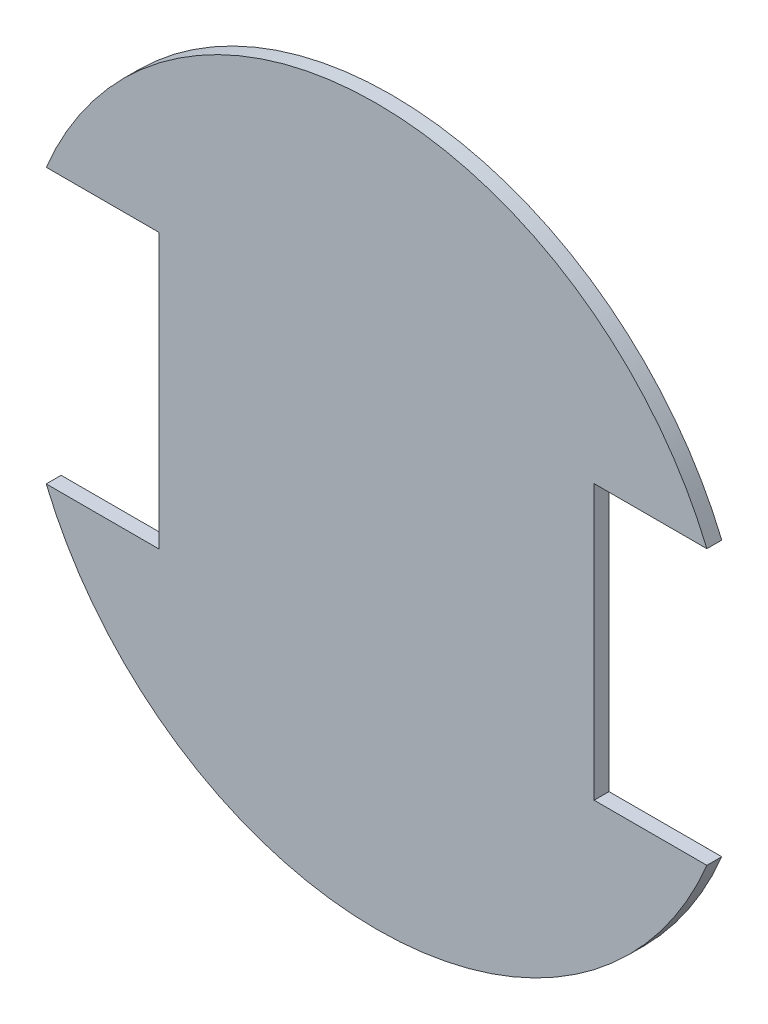
ISO-10303-21;
HEADER;
FILE_DESCRIPTION(('STEP AP214'),'2;1');
FILE_NAME('part.step','',(''),(''),'','','');
FILE_SCHEMA(('AUTOMOTIVE_DESIGN { 1 0 10303 214 1 1 1 1 }'));
ENDSEC;
DATA;
#1=APPLICATION_CONTEXT('core data for automotive mechanical design processes');
#2=APPLICATION_PROTOCOL_DEFINITION('international standard','automotive_design',2000,#1);
#3=PRODUCT_CONTEXT('',#1,'mechanical');
#4=PRODUCT('Part','Part','',(#3));
#5=PRODUCT_RELATED_PRODUCT_CATEGORY('part','',(#4));
#6=PRODUCT_DEFINITION_FORMATION('','',#4);
#7=PRODUCT_DEFINITION_CONTEXT('part definition',#1,'design');
#8=PRODUCT_DEFINITION('design','',#6,#7);
#9=PRODUCT_DEFINITION_SHAPE('','',#8);
#10=(LENGTH_UNIT() NAMED_UNIT(*) SI_UNIT(.MILLI.,.METRE.));
#11=(NAMED_UNIT(*) PLANE_ANGLE_UNIT() SI_UNIT($,.RADIAN.));
#12=(NAMED_UNIT(*) SI_UNIT($,.STERADIAN.) SOLID_ANGLE_UNIT());
#13=UNCERTAINTY_MEASURE_WITH_UNIT(LENGTH_MEASURE(1.E-05),#10,'distance_accuracy_value','');
#14=(GEOMETRIC_REPRESENTATION_CONTEXT(3) GLOBAL_UNCERTAINTY_ASSIGNED_CONTEXT((#13)) GLOBAL_UNIT_ASSIGNED_CONTEXT((#10,
#11,#12)) REPRESENTATION_CONTEXT('',''));
#15=CARTESIAN_POINT('',(0.,0.,0.));
#16=DIRECTION('',(0.,0.,1.));
#17=DIRECTION('',(1.,0.,0.));
#18=AXIS2_PLACEMENT_3D('',#15,#16,#17);
#19=CARTESIAN_POINT('',(73.,46.,5.));
#20=DIRECTION('',(0.,1.,0.));
#21=DIRECTION('',(0.,0.,1.));
#22=AXIS2_PLACEMENT_3D('',#19,#20,#21);
#23=PLANE('',#22);
#24=DIRECTION('',(1.,0.,0.));
#25=VECTOR('',#24,1.);
#26=CARTESIAN_POINT('',(73.,46.,0.));
#27=LINE('',#26,#25);
#28=CARTESIAN_POINT('',(73.,46.,0.));
#29=VERTEX_POINT('',#28);
#30=CARTESIAN_POINT('',(110.833208019979,46.,0.));
#31=VERTEX_POINT('',#30);
#32=EDGE_CURVE('E130',#29,#31,#27,.T.);
#33=ORIENTED_EDGE('',*,*,#32,.T.);
#34=DIRECTION('',(0.,0.,-1.));
#35=VECTOR('',#34,1.);
#36=CARTESIAN_POINT('',(110.833208019979,46.,5.));
#37=LINE('',#36,#35);
#38=CARTESIAN_POINT('',(110.833208019979,46.,5.));
#39=VERTEX_POINT('',#38);
#40=EDGE_CURVE('E11',#39,#31,#37,.T.);
#41=ORIENTED_EDGE('',*,*,#40,.F.);
#42=DIRECTION('',(1.,0.,0.));
#43=VECTOR('',#42,1.);
#44=CARTESIAN_POINT('',(73.,46.,5.));
#45=LINE('',#44,#43);
#46=CARTESIAN_POINT('',(73.,46.,5.));
#47=VERTEX_POINT('',#46);
#48=EDGE_CURVE('E144',#47,#39,#45,.T.);
#49=ORIENTED_EDGE('',*,*,#48,.F.);
#50=DIRECTION('',(0.,0.,-1.));
#51=VECTOR('',#50,1.);
#52=CARTESIAN_POINT('',(73.,46.,5.));
#53=LINE('',#52,#51);
#54=EDGE_CURVE('E126',#47,#29,#53,.T.);
#55=ORIENTED_EDGE('',*,*,#54,.T.);
#56=EDGE_LOOP('',(#33,#41,#49,#55));
#57=FACE_BOUND('',#56,.T.);
#58=ADVANCED_FACE('F34',(#57),#23,.F.);
#59=CARTESIAN_POINT('',(0.,0.,5.));
#60=DIRECTION('',(0.,0.,-1.));
#61=DIRECTION('',(-1.,0.,0.));
#62=AXIS2_PLACEMENT_3D('',#59,#60,#61);
#63=CYLINDRICAL_SURFACE('',#62,120.);
#64=CARTESIAN_POINT('',(0.,0.,0.));
#65=DIRECTION('',(0.,0.,1.));
#66=DIRECTION('',(1.,0.,0.));
#67=AXIS2_PLACEMENT_3D('',#64,#65,#66);
#68=CIRCLE('',#67,120.);
#69=CARTESIAN_POINT('',(-110.833208019979,46.,0.));
#70=VERTEX_POINT('',#69);
#71=EDGE_CURVE('E133',#31,#70,#68,.T.);
#72=ORIENTED_EDGE('',*,*,#71,.T.);
#73=DIRECTION('',(0.,0.,-1.));
#74=VECTOR('',#73,1.);
#75=CARTESIAN_POINT('',(-110.833208019979,46.,5.));
#76=LINE('',#75,#74);
#77=CARTESIAN_POINT('',(-110.833208019979,46.,5.));
#78=VERTEX_POINT('',#77);
#79=EDGE_CURVE('E42',#78,#70,#76,.T.);
#80=ORIENTED_EDGE('',*,*,#79,.F.);
#81=CARTESIAN_POINT('',(0.,0.,5.));
#82=DIRECTION('',(0.,0.,1.));
#83=DIRECTION('',(1.,0.,0.));
#84=AXIS2_PLACEMENT_3D('',#81,#82,#83);
#85=CIRCLE('',#84,120.);
#86=EDGE_CURVE('E93',#39,#78,#85,.T.);
#87=ORIENTED_EDGE('',*,*,#86,.F.);
#88=ORIENTED_EDGE('',*,*,#40,.T.);
#89=EDGE_LOOP('',(#72,#80,#87,#88));
#90=FACE_BOUND('',#89,.T.);
#91=ADVANCED_FACE('F179',(#90),#63,.T.);
#92=CARTESIAN_POINT('',(-73.,46.,5.));
#93=DIRECTION('',(0.,1.,0.));
#94=DIRECTION('',(0.,0.,1.));
#95=AXIS2_PLACEMENT_3D('',#92,#93,#94);
#96=PLANE('',#95);
#97=DIRECTION('',(1.,0.,0.));
#98=VECTOR('',#97,1.);
#99=CARTESIAN_POINT('',(-73.,46.,0.));
#100=LINE('',#99,#98);
#101=CARTESIAN_POINT('',(-73.,46.,0.));
#102=VERTEX_POINT('',#101);
#103=EDGE_CURVE('E135',#70,#102,#100,.T.);
#104=ORIENTED_EDGE('',*,*,#103,.T.);
#105=DIRECTION('',(0.,0.,-1.));
#106=VECTOR('',#105,1.);
#107=CARTESIAN_POINT('',(-73.,46.,5.));
#108=LINE('',#107,#106);
#109=CARTESIAN_POINT('',(-73.,46.,5.));
#110=VERTEX_POINT('',#109);
#111=EDGE_CURVE('E151',#110,#102,#108,.T.);
#112=ORIENTED_EDGE('',*,*,#111,.F.);
#113=DIRECTION('',(1.,0.,0.));
#114=VECTOR('',#113,1.);
#115=CARTESIAN_POINT('',(-73.,46.,5.));
#116=LINE('',#115,#114);
#117=EDGE_CURVE('E159',#78,#110,#116,.T.);
#118=ORIENTED_EDGE('',*,*,#117,.F.);
#119=ORIENTED_EDGE('',*,*,#79,.T.);
#120=EDGE_LOOP('',(#104,#112,#118,#119));
#121=FACE_BOUND('',#120,.T.);
#122=ADVANCED_FACE('F157',(#121),#96,.F.);
#123=CARTESIAN_POINT('',(-73.,-46.,5.));
#124=DIRECTION('',(1.,0.,0.));
#125=DIRECTION('',(0.,0.,-1.));
#126=AXIS2_PLACEMENT_3D('',#123,#124,#125);
#127=PLANE('',#126);
#128=DIRECTION('',(0.,-1.,0.));
#129=VECTOR('',#128,1.);
#130=CARTESIAN_POINT('',(-73.,-46.,0.));
#131=LINE('',#130,#129);
#132=CARTESIAN_POINT('',(-73.,-46.,0.));
#133=VERTEX_POINT('',#132);
#134=EDGE_CURVE('E137',#102,#133,#131,.T.);
#135=ORIENTED_EDGE('',*,*,#134,.T.);
#136=DIRECTION('',(0.,0.,-1.));
#137=VECTOR('',#136,1.);
#138=CARTESIAN_POINT('',(-73.,-46.,5.));
#139=LINE('',#138,#137);
#140=CARTESIAN_POINT('',(-73.,-46.,5.));
#141=VERTEX_POINT('',#140);
#142=EDGE_CURVE('E148',#141,#133,#139,.T.);
#143=ORIENTED_EDGE('',*,*,#142,.F.);
#144=DIRECTION('',(0.,-1.,0.));
#145=VECTOR('',#144,1.);
#146=CARTESIAN_POINT('',(-73.,-46.,5.));
#147=LINE('',#146,#145);
#148=EDGE_CURVE('E171',#110,#141,#147,.T.);
#149=ORIENTED_EDGE('',*,*,#148,.F.);
#150=ORIENTED_EDGE('',*,*,#111,.T.);
#151=EDGE_LOOP('',(#135,#143,#149,#150));
#152=FACE_BOUND('',#151,.T.);
#153=ADVANCED_FACE('F167',(#152),#127,.F.);
#154=CARTESIAN_POINT('',(-73.,-46.,5.));
#155=DIRECTION('',(0.,-1.,0.));
#156=DIRECTION('',(0.,0.,-1.));
#157=AXIS2_PLACEMENT_3D('',#154,#155,#156);
#158=PLANE('',#157);
#159=DIRECTION('',(-1.,0.,0.));
#160=VECTOR('',#159,1.);
#161=CARTESIAN_POINT('',(-73.,-46.,0.));
#162=LINE('',#161,#160);
#163=CARTESIAN_POINT('',(-110.833208019979,-46.,0.));
#164=VERTEX_POINT('',#163);
#165=EDGE_CURVE('E139',#133,#164,#162,.T.);
#166=ORIENTED_EDGE('',*,*,#165,.T.);
#167=DIRECTION('',(0.,0.,-1.));
#168=VECTOR('',#167,1.);
#169=CARTESIAN_POINT('',(-110.833208019979,-46.,5.));
#170=LINE('',#169,#168);
#171=CARTESIAN_POINT('',(-110.833208019979,-46.,5.));
#172=VERTEX_POINT('',#171);
#173=EDGE_CURVE('E121',#172,#164,#170,.T.);
#174=ORIENTED_EDGE('',*,*,#173,.F.);
#175=DIRECTION('',(-1.,0.,0.));
#176=VECTOR('',#175,1.);
#177=CARTESIAN_POINT('',(-73.,-46.,5.));
#178=LINE('',#177,#176);
#179=EDGE_CURVE('E112',#141,#172,#178,.T.);
#180=ORIENTED_EDGE('',*,*,#179,.F.);
#181=ORIENTED_EDGE('',*,*,#142,.T.);
#182=EDGE_LOOP('',(#166,#174,#180,#181));
#183=FACE_BOUND('',#182,.T.);
#184=ADVANCED_FACE('F170',(#183),#158,.F.);
#185=CARTESIAN_POINT('',(0.,0.,5.));
#186=DIRECTION('',(0.,0.,-1.));
#187=DIRECTION('',(-1.,0.,0.));
#188=AXIS2_PLACEMENT_3D('',#185,#186,#187);
#189=CYLINDRICAL_SURFACE('',#188,120.);
#190=CARTESIAN_POINT('',(0.,0.,0.));
#191=DIRECTION('',(0.,0.,1.));
#192=DIRECTION('',(1.,0.,0.));
#193=AXIS2_PLACEMENT_3D('',#190,#191,#192);
#194=CIRCLE('',#193,120.);
#195=CARTESIAN_POINT('',(110.833208019979,-46.,0.));
#196=VERTEX_POINT('',#195);
#197=EDGE_CURVE('E120',#164,#196,#194,.T.);
#198=ORIENTED_EDGE('',*,*,#197,.T.);
#199=DIRECTION('',(0.,0.,-1.));
#200=VECTOR('',#199,1.);
#201=CARTESIAN_POINT('',(110.833208019979,-46.,5.));
#202=LINE('',#201,#200);
#203=CARTESIAN_POINT('',(110.833208019979,-46.,5.));
#204=VERTEX_POINT('',#203);
#205=EDGE_CURVE('E117',#204,#196,#202,.T.);
#206=ORIENTED_EDGE('',*,*,#205,.F.);
#207=CARTESIAN_POINT('',(0.,0.,5.));
#208=DIRECTION('',(0.,0.,1.));
#209=DIRECTION('',(1.,0.,0.));
#210=AXIS2_PLACEMENT_3D('',#207,#208,#209);
#211=CIRCLE('',#210,120.);
#212=EDGE_CURVE('E106',#172,#204,#211,.T.);
#213=ORIENTED_EDGE('',*,*,#212,.F.);
#214=ORIENTED_EDGE('',*,*,#173,.T.);
#215=EDGE_LOOP('',(#198,#206,#213,#214));
#216=FACE_BOUND('',#215,.T.);
#217=ADVANCED_FACE('F118',(#216),#189,.T.);
#218=CARTESIAN_POINT('',(73.,-46.,5.));
#219=DIRECTION('',(0.,-1.,0.));
#220=DIRECTION('',(0.,0.,-1.));
#221=AXIS2_PLACEMENT_3D('',#218,#219,#220);
#222=PLANE('',#221);
#223=DIRECTION('',(-1.,0.,0.));
#224=VECTOR('',#223,1.);
#225=CARTESIAN_POINT('',(73.,-46.,0.));
#226=LINE('',#225,#224);
#227=CARTESIAN_POINT('',(73.,-46.,0.));
#228=VERTEX_POINT('',#227);
#229=EDGE_CURVE('E79',#196,#228,#226,.T.);
#230=ORIENTED_EDGE('',*,*,#229,.T.);
#231=DIRECTION('',(0.,0.,-1.));
#232=VECTOR('',#231,1.);
#233=CARTESIAN_POINT('',(73.,-46.,5.));
#234=LINE('',#233,#232);
#235=CARTESIAN_POINT('',(73.,-46.,5.));
#236=VERTEX_POINT('',#235);
#237=EDGE_CURVE('E122',#236,#228,#234,.T.);
#238=ORIENTED_EDGE('',*,*,#237,.F.);
#239=DIRECTION('',(-1.,0.,0.));
#240=VECTOR('',#239,1.);
#241=CARTESIAN_POINT('',(73.,-46.,5.));
#242=LINE('',#241,#240);
#243=EDGE_CURVE('E110',#204,#236,#242,.T.);
#244=ORIENTED_EDGE('',*,*,#243,.F.);
#245=ORIENTED_EDGE('',*,*,#205,.T.);
#246=EDGE_LOOP('',(#230,#238,#244,#245));
#247=FACE_BOUND('',#246,.T.);
#248=ADVANCED_FACE('F124',(#247),#222,.F.);
#249=CARTESIAN_POINT('',(73.,-46.,5.));
#250=DIRECTION('',(-1.,0.,0.));
#251=DIRECTION('',(0.,0.,1.));
#252=AXIS2_PLACEMENT_3D('',#249,#250,#251);
#253=PLANE('',#252);
#254=DIRECTION('',(0.,1.,0.));
#255=VECTOR('',#254,1.);
#256=CARTESIAN_POINT('',(73.,-46.,0.));
#257=LINE('',#256,#255);
#258=EDGE_CURVE('E85',#228,#29,#257,.T.);
#259=ORIENTED_EDGE('',*,*,#258,.T.);
#260=ORIENTED_EDGE('',*,*,#54,.F.);
#261=DIRECTION('',(0.,1.,0.));
#262=VECTOR('',#261,1.);
#263=CARTESIAN_POINT('',(73.,-46.,5.));
#264=LINE('',#263,#262);
#265=EDGE_CURVE('E50',#236,#47,#264,.T.);
#266=ORIENTED_EDGE('',*,*,#265,.F.);
#267=ORIENTED_EDGE('',*,*,#237,.T.);
#268=EDGE_LOOP('',(#259,#260,#266,#267));
#269=FACE_BOUND('',#268,.T.);
#270=ADVANCED_FACE('F195',(#269),#253,.F.);
#271=CARTESIAN_POINT('',(0.,0.,5.));
#272=DIRECTION('',(0.,0.,1.));
#273=DIRECTION('',(1.,0.,0.));
#274=AXIS2_PLACEMENT_3D('',#271,#272,#273);
#275=PLANE('',#274);
#276=ORIENTED_EDGE('',*,*,#48,.T.);
#277=ORIENTED_EDGE('',*,*,#86,.T.);
#278=ORIENTED_EDGE('',*,*,#117,.T.);
#279=ORIENTED_EDGE('',*,*,#148,.T.);
#280=ORIENTED_EDGE('',*,*,#179,.T.);
#281=ORIENTED_EDGE('',*,*,#212,.T.);
#282=ORIENTED_EDGE('',*,*,#243,.T.);
#283=ORIENTED_EDGE('',*,*,#265,.T.);
#284=EDGE_LOOP('',(#276,#277,#278,#279,#280,#281,#282,#283));
#285=FACE_BOUND('',#284,.T.);
#286=ADVANCED_FACE('F108',(#285),#275,.T.);
#287=CARTESIAN_POINT('',(0.,0.,0.));
#288=DIRECTION('',(0.,0.,1.));
#289=DIRECTION('',(1.,0.,0.));
#290=AXIS2_PLACEMENT_3D('',#287,#288,#289);
#291=PLANE('',#290);
#292=ORIENTED_EDGE('',*,*,#32,.F.);
#293=ORIENTED_EDGE('',*,*,#258,.F.);
#294=ORIENTED_EDGE('',*,*,#229,.F.);
#295=ORIENTED_EDGE('',*,*,#197,.F.);
#296=ORIENTED_EDGE('',*,*,#165,.F.);
#297=ORIENTED_EDGE('',*,*,#134,.F.);
#298=ORIENTED_EDGE('',*,*,#103,.F.);
#299=ORIENTED_EDGE('',*,*,#71,.F.);
#300=EDGE_LOOP('',(#292,#293,#294,#295,#296,#297,#298,#299));
#301=FACE_BOUND('',#300,.T.);
#302=ADVANCED_FACE('F163',(#301),#291,.F.);
#303=CLOSED_SHELL('',(#58,#91,#122,#153,#184,#217,#248,#270,#286,#302));
#304=MANIFOLD_SOLID_BREP('B2',#303);
#305=ADVANCED_BREP_SHAPE_REPRESENTATION('',(#18,#304),#14);
#306=SHAPE_DEFINITION_REPRESENTATION(#9,#305);
ENDSEC;
END-ISO-10303-21;
